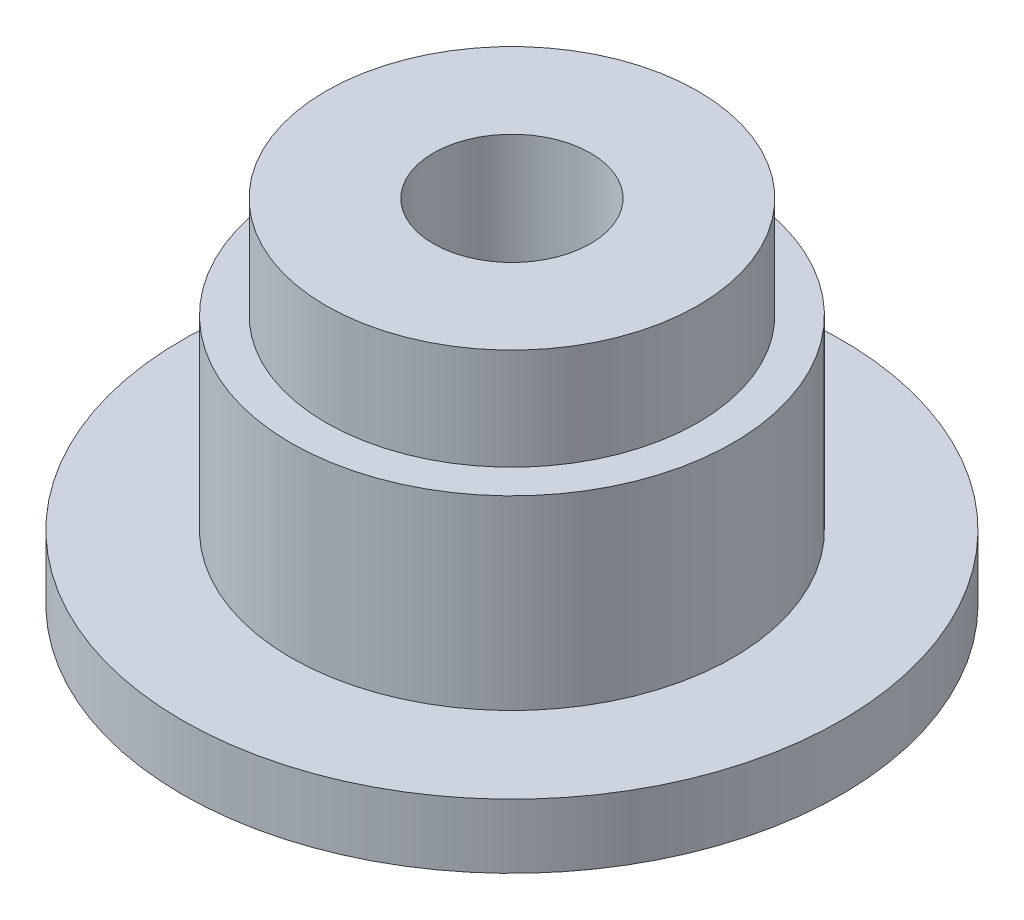
ISO-10303-21;
HEADER;
FILE_DESCRIPTION(('STEP AP214'),'2;1');
FILE_NAME('part.step','',(''),(''),'','','');
FILE_SCHEMA(('AUTOMOTIVE_DESIGN { 1 0 10303 214 1 1 1 1 }'));
ENDSEC;
DATA;
#1=APPLICATION_CONTEXT('core data for automotive mechanical design processes');
#2=APPLICATION_PROTOCOL_DEFINITION('international standard','automotive_design',2000,#1);
#3=PRODUCT_CONTEXT('',#1,'mechanical');
#4=PRODUCT('Part','Part','',(#3));
#5=PRODUCT_RELATED_PRODUCT_CATEGORY('part','',(#4));
#6=PRODUCT_DEFINITION_FORMATION('','',#4);
#7=PRODUCT_DEFINITION_CONTEXT('part definition',#1,'design');
#8=PRODUCT_DEFINITION('design','',#6,#7);
#9=PRODUCT_DEFINITION_SHAPE('','',#8);
#10=(LENGTH_UNIT() NAMED_UNIT(*) SI_UNIT(.MILLI.,.METRE.));
#11=(NAMED_UNIT(*) PLANE_ANGLE_UNIT() SI_UNIT($,.RADIAN.));
#12=(NAMED_UNIT(*) SI_UNIT($,.STERADIAN.) SOLID_ANGLE_UNIT());
#13=UNCERTAINTY_MEASURE_WITH_UNIT(LENGTH_MEASURE(1.E-05),#10,'distance_accuracy_value','');
#14=(GEOMETRIC_REPRESENTATION_CONTEXT(3) GLOBAL_UNCERTAINTY_ASSIGNED_CONTEXT((#13)) GLOBAL_UNIT_ASSIGNED_CONTEXT((#10,
#11,#12)) REPRESENTATION_CONTEXT('',''));
#15=CARTESIAN_POINT('',(0.,0.,0.));
#16=DIRECTION('',(0.,0.,1.));
#17=DIRECTION('',(1.,0.,0.));
#18=AXIS2_PLACEMENT_3D('',#15,#16,#17);
#19=CARTESIAN_POINT('',(0.,17.,0.));
#20=DIRECTION('',(0.,-1.,0.));
#21=DIRECTION('',(0.,0.,-1.));
#22=AXIS2_PLACEMENT_3D('',#19,#20,#21);
#23=CYLINDRICAL_SURFACE('',#22,4.65);
#24=CARTESIAN_POINT('',(0.,17.,0.));
#25=DIRECTION('',(0.,1.,0.));
#26=DIRECTION('',(0.,0.,1.));
#27=AXIS2_PLACEMENT_3D('',#24,#25,#26);
#28=CIRCLE('',#27,4.65);
#29=CARTESIAN_POINT('',(0.,17.,4.65));
#30=VERTEX_POINT('',#29);
#31=EDGE_CURVE('E43',#30,#30,#28,.T.);
#32=ORIENTED_EDGE('',*,*,#31,.T.);
#33=EDGE_LOOP('',(#32));
#34=FACE_BOUND('',#33,.T.);
#35=CARTESIAN_POINT('',(0.,-3.8,0.));
#36=DIRECTION('',(0.,-1.,0.));
#37=DIRECTION('',(0.,0.,-1.));
#38=AXIS2_PLACEMENT_3D('',#35,#36,#37);
#39=CIRCLE('',#38,4.65);
#40=CARTESIAN_POINT('',(0.,-3.8,-4.65));
#41=VERTEX_POINT('',#40);
#42=EDGE_CURVE('E63',#41,#41,#39,.T.);
#43=ORIENTED_EDGE('',*,*,#42,.T.);
#44=EDGE_LOOP('',(#43));
#45=FACE_BOUND('',#44,.T.);
#46=ADVANCED_FACE('F37',(#34,#45),#23,.F.);
#47=CARTESIAN_POINT('',(0.,17.,0.));
#48=DIRECTION('',(0.,-1.,0.));
#49=DIRECTION('',(0.,0.,-1.));
#50=AXIS2_PLACEMENT_3D('',#47,#48,#49);
#51=CYLINDRICAL_SURFACE('',#50,11.);
#52=CARTESIAN_POINT('',(0.,11.,0.));
#53=DIRECTION('',(0.,1.,0.));
#54=DIRECTION('',(0.,0.,1.));
#55=AXIS2_PLACEMENT_3D('',#52,#53,#54);
#56=CIRCLE('',#55,11.);
#57=CARTESIAN_POINT('',(0.,11.,11.));
#58=VERTEX_POINT('',#57);
#59=EDGE_CURVE('E51',#58,#58,#56,.T.);
#60=ORIENTED_EDGE('',*,*,#59,.T.);
#61=EDGE_LOOP('',(#60));
#62=FACE_BOUND('',#61,.T.);
#63=CARTESIAN_POINT('',(0.,17.,0.));
#64=DIRECTION('',(0.,1.,0.));
#65=DIRECTION('',(0.,0.,1.));
#66=AXIS2_PLACEMENT_3D('',#63,#64,#65);
#67=CIRCLE('',#66,11.);
#68=CARTESIAN_POINT('',(0.,17.,11.));
#69=VERTEX_POINT('',#68);
#70=EDGE_CURVE('E10',#69,#69,#67,.T.);
#71=ORIENTED_EDGE('',*,*,#70,.F.);
#72=EDGE_LOOP('',(#71));
#73=FACE_BOUND('',#72,.T.);
#74=ADVANCED_FACE('F87',(#62,#73),#51,.T.);
#75=CARTESIAN_POINT('',(0.,17.,0.));
#76=DIRECTION('',(0.,1.,0.));
#77=DIRECTION('',(0.,0.,1.));
#78=AXIS2_PLACEMENT_3D('',#75,#76,#77);
#79=PLANE('',#78);
#80=ORIENTED_EDGE('',*,*,#31,.F.);
#81=EDGE_LOOP('',(#80));
#82=FACE_BOUND('',#81,.T.);
#83=ORIENTED_EDGE('',*,*,#70,.T.);
#84=EDGE_LOOP('',(#83));
#85=FACE_BOUND('',#84,.T.);
#86=ADVANCED_FACE('F91',(#82,#85),#79,.T.);
#87=CARTESIAN_POINT('',(0.,11.,0.));
#88=DIRECTION('',(0.,-1.,0.));
#89=DIRECTION('',(0.,0.,-1.));
#90=AXIS2_PLACEMENT_3D('',#87,#88,#89);
#91=CYLINDRICAL_SURFACE('',#90,13.075);
#92=CARTESIAN_POINT('',(0.,11.,0.));
#93=DIRECTION('',(0.,1.,0.));
#94=DIRECTION('',(0.,0.,1.));
#95=AXIS2_PLACEMENT_3D('',#92,#93,#94);
#96=CIRCLE('',#95,13.075);
#97=CARTESIAN_POINT('',(0.,11.,13.075));
#98=VERTEX_POINT('',#97);
#99=EDGE_CURVE('E47',#98,#98,#96,.T.);
#100=ORIENTED_EDGE('',*,*,#99,.F.);
#101=EDGE_LOOP('',(#100));
#102=FACE_BOUND('',#101,.T.);
#103=CARTESIAN_POINT('',(0.,0.,0.));
#104=DIRECTION('',(0.,1.,0.));
#105=DIRECTION('',(0.,0.,1.));
#106=AXIS2_PLACEMENT_3D('',#103,#104,#105);
#107=CIRCLE('',#106,13.075);
#108=CARTESIAN_POINT('',(0.,0.,13.075));
#109=VERTEX_POINT('',#108);
#110=EDGE_CURVE('E54',#109,#109,#107,.T.);
#111=ORIENTED_EDGE('',*,*,#110,.T.);
#112=EDGE_LOOP('',(#111));
#113=FACE_BOUND('',#112,.T.);
#114=ADVANCED_FACE('F83',(#102,#113),#91,.T.);
#115=CARTESIAN_POINT('',(0.,11.,0.));
#116=DIRECTION('',(0.,1.,0.));
#117=DIRECTION('',(0.,0.,1.));
#118=AXIS2_PLACEMENT_3D('',#115,#116,#117);
#119=PLANE('',#118);
#120=ORIENTED_EDGE('',*,*,#59,.F.);
#121=EDGE_LOOP('',(#120));
#122=FACE_BOUND('',#121,.T.);
#123=ORIENTED_EDGE('',*,*,#99,.T.);
#124=EDGE_LOOP('',(#123));
#125=FACE_BOUND('',#124,.T.);
#126=ADVANCED_FACE('F73',(#122,#125),#119,.T.);
#127=CARTESIAN_POINT('',(0.,-3.8,0.));
#128=DIRECTION('',(0.,-1.,0.));
#129=DIRECTION('',(0.,0.,-1.));
#130=AXIS2_PLACEMENT_3D('',#127,#128,#129);
#131=PLANE('',#130);
#132=CARTESIAN_POINT('',(0.,-3.8,0.));
#133=DIRECTION('',(0.,-1.,0.));
#134=DIRECTION('',(0.,0.,-1.));
#135=AXIS2_PLACEMENT_3D('',#132,#133,#134);
#136=CIRCLE('',#135,19.5);
#137=CARTESIAN_POINT('',(0.,-3.8,19.5));
#138=VERTEX_POINT('',#137);
#139=EDGE_CURVE('E56',#138,#138,#136,.T.);
#140=ORIENTED_EDGE('',*,*,#139,.T.);
#141=EDGE_LOOP('',(#140));
#142=FACE_BOUND('',#141,.T.);
#143=ORIENTED_EDGE('',*,*,#42,.F.);
#144=EDGE_LOOP('',(#143));
#145=FACE_BOUND('',#144,.T.);
#146=ADVANCED_FACE('F70',(#142,#145),#131,.T.);
#147=CARTESIAN_POINT('',(0.,0.,0.));
#148=DIRECTION('',(0.,-1.,0.));
#149=DIRECTION('',(0.,0.,-1.));
#150=AXIS2_PLACEMENT_3D('',#147,#148,#149);
#151=PLANE('',#150);
#152=ORIENTED_EDGE('',*,*,#110,.F.);
#153=EDGE_LOOP('',(#152));
#154=FACE_BOUND('',#153,.T.);
#155=CARTESIAN_POINT('',(0.,0.,0.));
#156=DIRECTION('',(0.,-1.,0.));
#157=DIRECTION('',(0.,0.,-1.));
#158=AXIS2_PLACEMENT_3D('',#155,#156,#157);
#159=CIRCLE('',#158,19.5);
#160=CARTESIAN_POINT('',(0.,0.,19.5));
#161=VERTEX_POINT('',#160);
#162=EDGE_CURVE('E60',#161,#161,#159,.T.);
#163=ORIENTED_EDGE('',*,*,#162,.F.);
#164=EDGE_LOOP('',(#163));
#165=FACE_BOUND('',#164,.T.);
#166=ADVANCED_FACE('F72',(#154,#165),#151,.F.);
#167=CARTESIAN_POINT('',(0.,-3.8,0.));
#168=DIRECTION('',(0.,1.,0.));
#169=DIRECTION('',(0.,0.,1.));
#170=AXIS2_PLACEMENT_3D('',#167,#168,#169);
#171=CYLINDRICAL_SURFACE('',#170,19.5);
#172=CARTESIAN_POINT('',(0.,-3.8,19.5));
#173=CARTESIAN_POINT('',(0.,-3.76041666666667,19.5));
#174=CARTESIAN_POINT('',(0.,-3.72083333333333,19.5));
#175=CARTESIAN_POINT('',(0.,-3.64166666666667,19.5));
#176=CARTESIAN_POINT('',(0.,-3.60208333333333,19.5));
#177=CARTESIAN_POINT('',(0.,-3.52291666666667,19.5));
#178=CARTESIAN_POINT('',(0.,-3.48333333333333,19.5));
#179=CARTESIAN_POINT('',(0.,-3.40416666666667,19.5));
#180=CARTESIAN_POINT('',(0.,-3.36458333333333,19.5));
#181=CARTESIAN_POINT('',(0.,-3.28541666666667,19.5));
#182=CARTESIAN_POINT('',(0.,-3.24583333333333,19.5));
#183=CARTESIAN_POINT('',(0.,-3.16666666666667,19.5));
#184=CARTESIAN_POINT('',(0.,-3.12708333333333,19.5));
#185=CARTESIAN_POINT('',(0.,-3.04791666666667,19.5));
#186=CARTESIAN_POINT('',(0.,-3.00833333333333,19.5));
#187=CARTESIAN_POINT('',(0.,-2.92916666666667,19.5));
#188=CARTESIAN_POINT('',(0.,-2.88958333333333,19.5));
#189=CARTESIAN_POINT('',(0.,-2.81041666666667,19.5));
#190=CARTESIAN_POINT('',(0.,-2.77083333333333,19.5));
#191=CARTESIAN_POINT('',(0.,-2.69166666666667,19.5));
#192=CARTESIAN_POINT('',(0.,-2.65208333333333,19.5));
#193=CARTESIAN_POINT('',(0.,-2.57291666666667,19.5));
#194=CARTESIAN_POINT('',(0.,-2.53333333333333,19.5));
#195=CARTESIAN_POINT('',(0.,-2.45416666666667,19.5));
#196=CARTESIAN_POINT('',(0.,-2.41458333333333,19.5));
#197=CARTESIAN_POINT('',(0.,-2.33541666666667,19.5));
#198=CARTESIAN_POINT('',(0.,-2.29583333333333,19.5));
#199=CARTESIAN_POINT('',(0.,-2.21666666666667,19.5));
#200=CARTESIAN_POINT('',(0.,-2.17708333333333,19.5));
#201=CARTESIAN_POINT('',(0.,-2.09791666666667,19.5));
#202=CARTESIAN_POINT('',(0.,-2.05833333333333,19.5));
#203=CARTESIAN_POINT('',(0.,-1.97916666666667,19.5));
#204=CARTESIAN_POINT('',(0.,-1.93958333333333,19.5));
#205=CARTESIAN_POINT('',(0.,-1.86041666666667,19.5));
#206=CARTESIAN_POINT('',(0.,-1.82083333333333,19.5));
#207=CARTESIAN_POINT('',(0.,-1.74166666666667,19.5));
#208=CARTESIAN_POINT('',(0.,-1.70208333333333,19.5));
#209=CARTESIAN_POINT('',(0.,-1.62291666666667,19.5));
#210=CARTESIAN_POINT('',(0.,-1.58333333333333,19.5));
#211=CARTESIAN_POINT('',(0.,-1.50416666666667,19.5));
#212=CARTESIAN_POINT('',(0.,-1.46458333333333,19.5));
#213=CARTESIAN_POINT('',(0.,-1.38541666666667,19.5));
#214=CARTESIAN_POINT('',(0.,-1.34583333333333,19.5));
#215=CARTESIAN_POINT('',(0.,-1.26666666666667,19.5));
#216=CARTESIAN_POINT('',(0.,-1.22708333333333,19.5));
#217=CARTESIAN_POINT('',(0.,-1.14791666666667,19.5));
#218=CARTESIAN_POINT('',(0.,-1.10833333333333,19.5));
#219=CARTESIAN_POINT('',(0.,-1.02916666666667,19.5));
#220=CARTESIAN_POINT('',(0.,-0.989583333333334,19.5));
#221=CARTESIAN_POINT('',(0.,-0.910416666666667,19.5));
#222=CARTESIAN_POINT('',(0.,-0.870833333333333,19.5));
#223=CARTESIAN_POINT('',(0.,-0.791666666666667,19.5));
#224=CARTESIAN_POINT('',(0.,-0.752083333333333,19.5));
#225=CARTESIAN_POINT('',(0.,-0.672916666666667,19.5));
#226=CARTESIAN_POINT('',(0.,-0.633333333333333,19.5));
#227=CARTESIAN_POINT('',(0.,-0.554166666666667,19.5));
#228=CARTESIAN_POINT('',(0.,-0.514583333333334,19.5));
#229=CARTESIAN_POINT('',(0.,-0.435416666666667,19.5));
#230=CARTESIAN_POINT('',(0.,-0.395833333333334,19.5));
#231=CARTESIAN_POINT('',(0.,-0.316666666666667,19.5));
#232=CARTESIAN_POINT('',(0.,-0.277083333333333,19.5));
#233=CARTESIAN_POINT('',(0.,-0.197916666666667,19.5));
#234=CARTESIAN_POINT('',(0.,-0.158333333333333,19.5));
#235=CARTESIAN_POINT('',(0.,-0.0791666666666666,19.5));
#236=CARTESIAN_POINT('',(0.,-0.0395833333333333,19.5));
#237=CARTESIAN_POINT('',(0.,0.,19.5));
#238=B_SPLINE_CURVE_WITH_KNOTS('',3,(#172,#173,#174,#175,#176,#177,#178,#179,#180,#181,#182,
#183,#184,#185,#186,#187,#188,#189,#190,#191,#192,#193,#194,#195,#196,#197,#198,#199,#200,#201,
#202,#203,#204,#205,#206,#207,#208,#209,#210,#211,#212,#213,#214,#215,#216,#217,#218,#219,#220,
#221,#222,#223,#224,#225,#226,#227,#228,#229,#230,#231,#232,#233,#234,#235,#236,#237),
.UNSPECIFIED.,.F.,.F.,(4,2,2,2,2,2,2,2,2,2,2,2,2,2,2,2,2,2,2,2,2,2,2,2,2,2,2,2,2,2,2,2,4),(0.,
0.11875,0.2375,0.35625,0.475,0.59375,0.7125,0.83125,0.95,1.06875,1.1875,1.30625,1.425,1.54375,
1.6625,1.78125,1.9,2.01875,2.1375,2.25625,2.375,2.49375,2.6125,2.73125,2.85,2.96875,3.0875,
3.20625,3.325,3.44375,3.5625,3.68125,3.8),.UNSPECIFIED.);
#239=EDGE_CURVE('BSEAM80',#138,#161,#238,.T.);
#240=ORIENTED_EDGE('',*,*,#139,.F.);
#241=ORIENTED_EDGE('',*,*,#162,.T.);
#242=ORIENTED_EDGE('',*,*,#239,.T.);
#243=ORIENTED_EDGE('',*,*,#239,.F.);
#244=EDGE_LOOP('',(#240,#242,#241,#243));
#245=FACE_BOUND('',#244,.T.);
#246=ADVANCED_FACE('F80',(#245),#171,.T.);
#247=CLOSED_SHELL('',(#46,#74,#86,#114,#126,#146,#166,#246));
#248=MANIFOLD_SOLID_BREP('B2',#247);
#249=ADVANCED_BREP_SHAPE_REPRESENTATION('',(#18,#248),#14);
#250=SHAPE_DEFINITION_REPRESENTATION(#9,#249);
ENDSEC;
END-ISO-10303-21;
